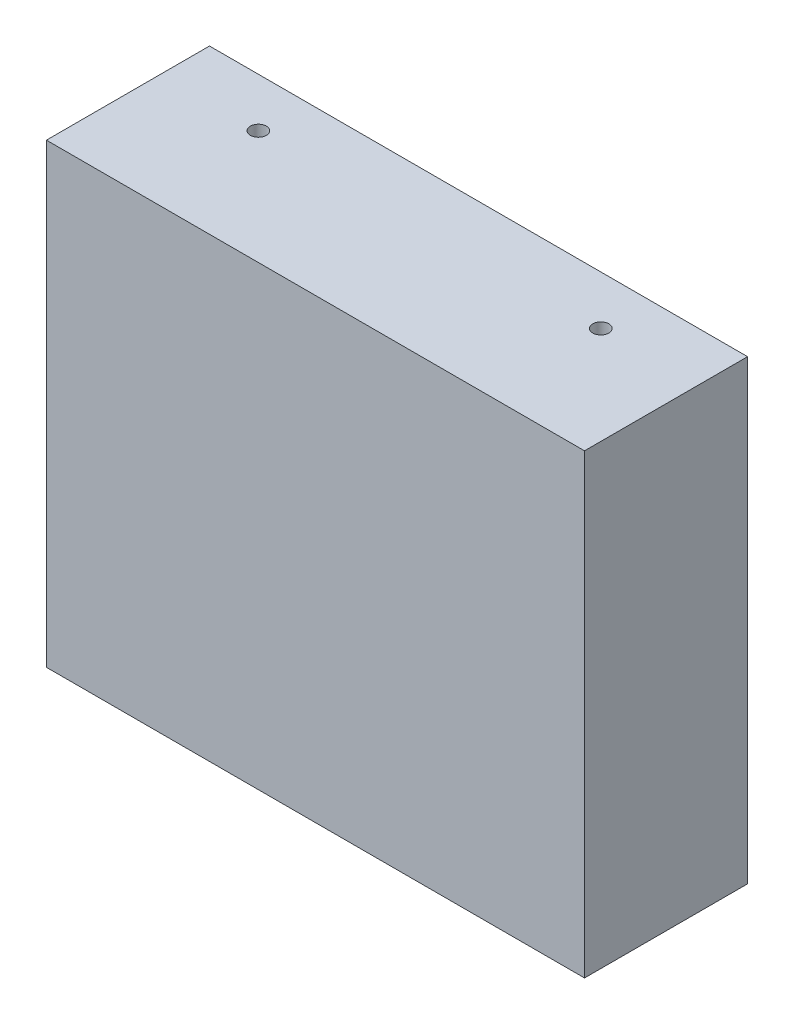
ISO-10303-21;
HEADER;
FILE_DESCRIPTION(('STEP AP214'),'2;1');
FILE_NAME('part.step','',(''),(''),'','','');
FILE_SCHEMA(('AUTOMOTIVE_DESIGN { 1 0 10303 214 1 1 1 1 }'));
ENDSEC;
DATA;
#1=APPLICATION_CONTEXT('core data for automotive mechanical design processes');
#2=APPLICATION_PROTOCOL_DEFINITION('international standard','automotive_design',2000,#1);
#3=PRODUCT_CONTEXT('',#1,'mechanical');
#4=PRODUCT('Part','Part','',(#3));
#5=PRODUCT_RELATED_PRODUCT_CATEGORY('part','',(#4));
#6=PRODUCT_DEFINITION_FORMATION('','',#4);
#7=PRODUCT_DEFINITION_CONTEXT('part definition',#1,'design');
#8=PRODUCT_DEFINITION('design','',#6,#7);
#9=PRODUCT_DEFINITION_SHAPE('','',#8);
#10=(LENGTH_UNIT() NAMED_UNIT(*) SI_UNIT(.MILLI.,.METRE.));
#11=(NAMED_UNIT(*) PLANE_ANGLE_UNIT() SI_UNIT($,.RADIAN.));
#12=(NAMED_UNIT(*) SI_UNIT($,.STERADIAN.) SOLID_ANGLE_UNIT());
#13=UNCERTAINTY_MEASURE_WITH_UNIT(LENGTH_MEASURE(1.E-05),#10,'distance_accuracy_value','');
#14=(GEOMETRIC_REPRESENTATION_CONTEXT(3) GLOBAL_UNCERTAINTY_ASSIGNED_CONTEXT((#13)) GLOBAL_UNIT_ASSIGNED_CONTEXT((#10,
#11,#12)) REPRESENTATION_CONTEXT('',''));
#15=CARTESIAN_POINT('',(0.,0.,0.));
#16=DIRECTION('',(0.,0.,1.));
#17=DIRECTION('',(1.,0.,0.));
#18=AXIS2_PLACEMENT_3D('',#15,#16,#17);
#19=CARTESIAN_POINT('',(-419.1,-355.6,254.));
#20=DIRECTION('',(1.,0.,0.));
#21=DIRECTION('',(0.,0.,-1.));
#22=AXIS2_PLACEMENT_3D('',#19,#20,#21);
#23=PLANE('',#22);
#24=DIRECTION('',(0.,-1.,0.));
#25=VECTOR('',#24,1.);
#26=CARTESIAN_POINT('',(-419.1,-355.6,0.));
#27=LINE('',#26,#25);
#28=CARTESIAN_POINT('',(-419.1,355.6,0.));
#29=VERTEX_POINT('',#28);
#30=CARTESIAN_POINT('',(-419.1,-355.6,0.));
#31=VERTEX_POINT('',#30);
#32=EDGE_CURVE('E96',#29,#31,#27,.T.);
#33=ORIENTED_EDGE('',*,*,#32,.T.);
#34=DIRECTION('',(0.,0.,-1.));
#35=VECTOR('',#34,1.);
#36=CARTESIAN_POINT('',(-419.1,-355.6,254.));
#37=LINE('',#36,#35);
#38=CARTESIAN_POINT('',(-419.1,-355.6,254.));
#39=VERTEX_POINT('',#38);
#40=EDGE_CURVE('E11',#39,#31,#37,.T.);
#41=ORIENTED_EDGE('',*,*,#40,.F.);
#42=DIRECTION('',(0.,-1.,0.));
#43=VECTOR('',#42,1.);
#44=CARTESIAN_POINT('',(-419.1,-355.6,254.));
#45=LINE('',#44,#43);
#46=CARTESIAN_POINT('',(-419.1,355.6,254.));
#47=VERTEX_POINT('',#46);
#48=EDGE_CURVE('E84',#47,#39,#45,.T.);
#49=ORIENTED_EDGE('',*,*,#48,.F.);
#50=DIRECTION('',(0.,0.,-1.));
#51=VECTOR('',#50,1.);
#52=CARTESIAN_POINT('',(-419.1,355.6,254.));
#53=LINE('',#52,#51);
#54=EDGE_CURVE('E92',#47,#29,#53,.T.);
#55=ORIENTED_EDGE('',*,*,#54,.T.);
#56=EDGE_LOOP('',(#33,#41,#49,#55));
#57=FACE_BOUND('',#56,.T.);
#58=ADVANCED_FACE('F33',(#57),#23,.F.);
#59=CARTESIAN_POINT('',(419.1,-355.6,254.));
#60=DIRECTION('',(0.,1.,0.));
#61=DIRECTION('',(-1.,0.,0.));
#62=AXIS2_PLACEMENT_3D('',#59,#60,#61);
#63=PLANE('',#62);
#64=CARTESIAN_POINT('',(-266.7,-355.6,76.2));
#65=DIRECTION('',(0.,-1.,0.));
#66=DIRECTION('',(0.,0.,-1.));
#67=AXIS2_PLACEMENT_3D('',#64,#65,#66);
#68=CIRCLE('',#67,12.4999999999999);
#69=CARTESIAN_POINT('',(-266.7,-355.6,63.7000000000001));
#70=VERTEX_POINT('',#69);
#71=EDGE_CURVE('E118',#70,#70,#68,.T.);
#72=ORIENTED_EDGE('',*,*,#71,.F.);
#73=EDGE_LOOP('',(#72));
#74=FACE_BOUND('',#73,.T.);
#75=CARTESIAN_POINT('',(266.7,-355.6,76.2000000000001));
#76=DIRECTION('',(0.,-1.,0.));
#77=DIRECTION('',(0.,0.,-1.));
#78=AXIS2_PLACEMENT_3D('',#75,#76,#77);
#79=CIRCLE('',#78,12.4999999999999);
#80=CARTESIAN_POINT('',(266.7,-355.6,63.7000000000002));
#81=VERTEX_POINT('',#80);
#82=EDGE_CURVE('E112',#81,#81,#79,.T.);
#83=ORIENTED_EDGE('',*,*,#82,.F.);
#84=EDGE_LOOP('',(#83));
#85=FACE_BOUND('',#84,.T.);
#86=DIRECTION('',(1.,0.,0.));
#87=VECTOR('',#86,1.);
#88=CARTESIAN_POINT('',(419.1,-355.6,0.));
#89=LINE('',#88,#87);
#90=CARTESIAN_POINT('',(419.1,-355.6,0.));
#91=VERTEX_POINT('',#90);
#92=EDGE_CURVE('E88',#31,#91,#89,.T.);
#93=ORIENTED_EDGE('',*,*,#92,.T.);
#94=DIRECTION('',(0.,0.,-1.));
#95=VECTOR('',#94,1.);
#96=CARTESIAN_POINT('',(419.1,-355.6,254.));
#97=LINE('',#96,#95);
#98=CARTESIAN_POINT('',(419.1,-355.6,254.));
#99=VERTEX_POINT('',#98);
#100=EDGE_CURVE('E41',#99,#91,#97,.T.);
#101=ORIENTED_EDGE('',*,*,#100,.F.);
#102=DIRECTION('',(1.,0.,0.));
#103=VECTOR('',#102,1.);
#104=CARTESIAN_POINT('',(419.1,-355.6,254.));
#105=LINE('',#104,#103);
#106=EDGE_CURVE('E79',#39,#99,#105,.T.);
#107=ORIENTED_EDGE('',*,*,#106,.F.);
#108=ORIENTED_EDGE('',*,*,#40,.T.);
#109=EDGE_LOOP('',(#93,#101,#107,#108));
#110=FACE_BOUND('',#109,.T.);
#111=ADVANCED_FACE('F87',(#74,#85,#110),#63,.F.);
#112=CARTESIAN_POINT('',(419.1,-355.6,254.));
#113=DIRECTION('',(-1.,0.,0.));
#114=DIRECTION('',(0.,-1.,0.));
#115=AXIS2_PLACEMENT_3D('',#112,#113,#114);
#116=PLANE('',#115);
#117=DIRECTION('',(0.,1.,0.));
#118=VECTOR('',#117,1.);
#119=CARTESIAN_POINT('',(419.1,-355.6,0.));
#120=LINE('',#119,#118);
#121=CARTESIAN_POINT('',(419.1,355.6,0.));
#122=VERTEX_POINT('',#121);
#123=EDGE_CURVE('E66',#91,#122,#120,.T.);
#124=ORIENTED_EDGE('',*,*,#123,.T.);
#125=DIRECTION('',(0.,0.,-1.));
#126=VECTOR('',#125,1.);
#127=CARTESIAN_POINT('',(419.1,355.6,254.));
#128=LINE('',#127,#126);
#129=CARTESIAN_POINT('',(419.1,355.6,254.));
#130=VERTEX_POINT('',#129);
#131=EDGE_CURVE('E89',#130,#122,#128,.T.);
#132=ORIENTED_EDGE('',*,*,#131,.F.);
#133=DIRECTION('',(0.,1.,0.));
#134=VECTOR('',#133,1.);
#135=CARTESIAN_POINT('',(419.1,-355.6,254.));
#136=LINE('',#135,#134);
#137=EDGE_CURVE('E82',#99,#130,#136,.T.);
#138=ORIENTED_EDGE('',*,*,#137,.F.);
#139=ORIENTED_EDGE('',*,*,#100,.T.);
#140=EDGE_LOOP('',(#124,#132,#138,#139));
#141=FACE_BOUND('',#140,.T.);
#142=ADVANCED_FACE('F90',(#141),#116,.F.);
#143=CARTESIAN_POINT('',(419.1,355.6,254.));
#144=DIRECTION('',(0.,-1.,0.));
#145=DIRECTION('',(1.,0.,0.));
#146=AXIS2_PLACEMENT_3D('',#143,#144,#145);
#147=PLANE('',#146);
#148=CARTESIAN_POINT('',(-266.7,355.6,76.2));
#149=DIRECTION('',(0.,-1.,0.));
#150=DIRECTION('',(0.,0.,-1.));
#151=AXIS2_PLACEMENT_3D('',#148,#149,#150);
#152=CIRCLE('',#151,12.4999999999998);
#153=CARTESIAN_POINT('',(-266.7,355.6,63.7000000000002));
#154=VERTEX_POINT('',#153);
#155=EDGE_CURVE('E115',#154,#154,#152,.T.);
#156=ORIENTED_EDGE('',*,*,#155,.T.);
#157=EDGE_LOOP('',(#156));
#158=FACE_BOUND('',#157,.T.);
#159=CARTESIAN_POINT('',(266.7,355.6,76.2000000000001));
#160=DIRECTION('',(0.,-1.,0.));
#161=DIRECTION('',(0.,0.,-1.));
#162=AXIS2_PLACEMENT_3D('',#159,#160,#161);
#163=CIRCLE('',#162,12.4999999999998);
#164=CARTESIAN_POINT('',(266.7,355.6,63.7000000000002));
#165=VERTEX_POINT('',#164);
#166=EDGE_CURVE('E99',#165,#165,#163,.T.);
#167=ORIENTED_EDGE('',*,*,#166,.T.);
#168=EDGE_LOOP('',(#167));
#169=FACE_BOUND('',#168,.T.);
#170=DIRECTION('',(-1.,0.,0.));
#171=VECTOR('',#170,1.);
#172=CARTESIAN_POINT('',(419.1,355.6,0.));
#173=LINE('',#172,#171);
#174=EDGE_CURVE('E72',#122,#29,#173,.T.);
#175=ORIENTED_EDGE('',*,*,#174,.T.);
#176=ORIENTED_EDGE('',*,*,#54,.F.);
#177=DIRECTION('',(-1.,0.,0.));
#178=VECTOR('',#177,1.);
#179=CARTESIAN_POINT('',(419.1,355.6,254.));
#180=LINE('',#179,#178);
#181=EDGE_CURVE('E49',#130,#47,#180,.T.);
#182=ORIENTED_EDGE('',*,*,#181,.F.);
#183=ORIENTED_EDGE('',*,*,#131,.T.);
#184=EDGE_LOOP('',(#175,#176,#182,#183));
#185=FACE_BOUND('',#184,.T.);
#186=ADVANCED_FACE('F104',(#158,#169,#185),#147,.F.);
#187=CARTESIAN_POINT('',(0.,0.,254.));
#188=DIRECTION('',(0.,0.,1.));
#189=DIRECTION('',(1.,0.,0.));
#190=AXIS2_PLACEMENT_3D('',#187,#188,#189);
#191=PLANE('',#190);
#192=ORIENTED_EDGE('',*,*,#48,.T.);
#193=ORIENTED_EDGE('',*,*,#106,.T.);
#194=ORIENTED_EDGE('',*,*,#137,.T.);
#195=ORIENTED_EDGE('',*,*,#181,.T.);
#196=EDGE_LOOP('',(#192,#193,#194,#195));
#197=FACE_BOUND('',#196,.T.);
#198=ADVANCED_FACE('F80',(#197),#191,.T.);
#199=CARTESIAN_POINT('',(0.,0.,0.));
#200=DIRECTION('',(0.,0.,1.));
#201=DIRECTION('',(1.,0.,0.));
#202=AXIS2_PLACEMENT_3D('',#199,#200,#201);
#203=PLANE('',#202);
#204=ORIENTED_EDGE('',*,*,#32,.F.);
#205=ORIENTED_EDGE('',*,*,#174,.F.);
#206=ORIENTED_EDGE('',*,*,#123,.F.);
#207=ORIENTED_EDGE('',*,*,#92,.F.);
#208=EDGE_LOOP('',(#204,#205,#206,#207));
#209=FACE_BOUND('',#208,.T.);
#210=ADVANCED_FACE('F107',(#209),#203,.F.);
#211=CARTESIAN_POINT('',(266.7,-355.6,76.2000000000001));
#212=DIRECTION('',(0.,-1.,0.));
#213=DIRECTION('',(0.,0.,-1.));
#214=AXIS2_PLACEMENT_3D('',#211,#212,#213);
#215=CYLINDRICAL_SURFACE('',#214,12.4999999999999);
#216=ORIENTED_EDGE('',*,*,#166,.F.);
#217=EDGE_LOOP('',(#216));
#218=FACE_BOUND('',#217,.T.);
#219=ORIENTED_EDGE('',*,*,#82,.T.);
#220=EDGE_LOOP('',(#219));
#221=FACE_BOUND('',#220,.T.);
#222=ADVANCED_FACE('F128',(#218,#221),#215,.F.);
#223=CARTESIAN_POINT('',(-266.7,-355.6,76.2));
#224=DIRECTION('',(0.,-1.,0.));
#225=DIRECTION('',(0.,0.,-1.));
#226=AXIS2_PLACEMENT_3D('',#223,#224,#225);
#227=CYLINDRICAL_SURFACE('',#226,12.4999999999999);
#228=ORIENTED_EDGE('',*,*,#155,.F.);
#229=EDGE_LOOP('',(#228));
#230=FACE_BOUND('',#229,.T.);
#231=ORIENTED_EDGE('',*,*,#71,.T.);
#232=EDGE_LOOP('',(#231));
#233=FACE_BOUND('',#232,.T.);
#234=ADVANCED_FACE('F122',(#230,#233),#227,.F.);
#235=CLOSED_SHELL('',(#58,#111,#142,#186,#198,#210,#222,#234));
#236=MANIFOLD_SOLID_BREP('B2',#235);
#237=ADVANCED_BREP_SHAPE_REPRESENTATION('',(#18,#236),#14);
#238=SHAPE_DEFINITION_REPRESENTATION(#9,#237);
ENDSEC;
END-ISO-10303-21;
